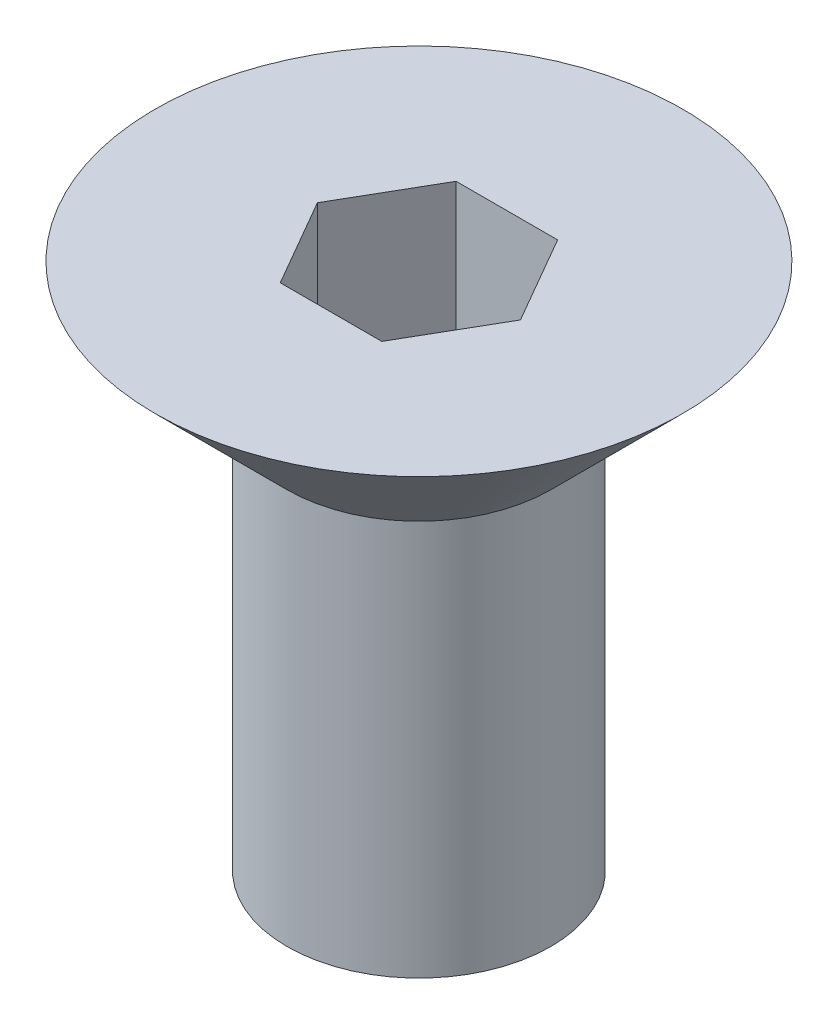
ISO-10303-21;
HEADER;
FILE_DESCRIPTION(('STEP AP214'),'2;1');
FILE_NAME('part.step','',(''),(''),'','','');
FILE_SCHEMA(('AUTOMOTIVE_DESIGN { 1 0 10303 214 1 1 1 1 }'));
ENDSEC;
DATA;
#1=APPLICATION_CONTEXT('core data for automotive mechanical design processes');
#2=APPLICATION_PROTOCOL_DEFINITION('international standard','automotive_design',2000,#1);
#3=PRODUCT_CONTEXT('',#1,'mechanical');
#4=PRODUCT('Part','Part','',(#3));
#5=PRODUCT_RELATED_PRODUCT_CATEGORY('part','',(#4));
#6=PRODUCT_DEFINITION_FORMATION('','',#4);
#7=PRODUCT_DEFINITION_CONTEXT('part definition',#1,'design');
#8=PRODUCT_DEFINITION('design','',#6,#7);
#9=PRODUCT_DEFINITION_SHAPE('','',#8);
#10=(LENGTH_UNIT() NAMED_UNIT(*) SI_UNIT(.MILLI.,.METRE.));
#11=(NAMED_UNIT(*) PLANE_ANGLE_UNIT() SI_UNIT($,.RADIAN.));
#12=(NAMED_UNIT(*) SI_UNIT($,.STERADIAN.) SOLID_ANGLE_UNIT());
#13=UNCERTAINTY_MEASURE_WITH_UNIT(LENGTH_MEASURE(1.E-05),#10,'distance_accuracy_value','');
#14=(GEOMETRIC_REPRESENTATION_CONTEXT(3) GLOBAL_UNCERTAINTY_ASSIGNED_CONTEXT((#13)) GLOBAL_UNIT_ASSIGNED_CONTEXT((#10,
#11,#12)) REPRESENTATION_CONTEXT('',''));
#15=CARTESIAN_POINT('',(0.,0.,0.));
#16=DIRECTION('',(0.,0.,1.));
#17=DIRECTION('',(1.,0.,0.));
#18=AXIS2_PLACEMENT_3D('',#15,#16,#17);
#19=CARTESIAN_POINT('',(0.,-6.,0.));
#20=DIRECTION('',(0.,1.,0.));
#21=DIRECTION('',(0.,0.,1.));
#22=AXIS2_PLACEMENT_3D('',#19,#20,#21);
#23=PLANE('',#22);
#24=CARTESIAN_POINT('',(0.,-6.00000000000001,0.));
#25=DIRECTION('',(0.,1.,0.));
#26=DIRECTION('',(0.,0.,1.));
#27=AXIS2_PLACEMENT_3D('',#24,#25,#26);
#28=CIRCLE('',#27,1.50000000000001);
#29=CARTESIAN_POINT('',(0.,-6.00000000000001,1.50000000000001));
#30=VERTEX_POINT('',#29);
#31=EDGE_CURVE('E11',#30,#30,#28,.T.);
#32=ORIENTED_EDGE('',*,*,#31,.F.);
#33=EDGE_LOOP('',(#32));
#34=FACE_BOUND('',#33,.T.);
#35=ADVANCED_FACE('F34',(#34),#23,.F.);
#36=CARTESIAN_POINT('',(0.,61.6916426261037,0.));
#37=DIRECTION('',(0.,1.,0.));
#38=DIRECTION('',(0.,0.,1.));
#39=AXIS2_PLACEMENT_3D('',#36,#37,#38);
#40=CYLINDRICAL_SURFACE('',#39,1.50000000000001);
#41=CARTESIAN_POINT('',(0.,-1.50000000000002,0.));
#42=DIRECTION('',(0.,1.,0.));
#43=DIRECTION('',(0.,0.,1.));
#44=AXIS2_PLACEMENT_3D('',#41,#42,#43);
#45=CIRCLE('',#44,1.50000000000001);
#46=CARTESIAN_POINT('',(0.,-1.50000000000002,1.50000000000001));
#47=VERTEX_POINT('',#46);
#48=EDGE_CURVE('E41',#47,#47,#45,.T.);
#49=ORIENTED_EDGE('',*,*,#48,.F.);
#50=EDGE_LOOP('',(#49));
#51=FACE_BOUND('',#50,.T.);
#52=ORIENTED_EDGE('',*,*,#31,.T.);
#53=EDGE_LOOP('',(#52));
#54=FACE_BOUND('',#53,.T.);
#55=ADVANCED_FACE('F147',(#51,#54),#40,.T.);
#56=CARTESIAN_POINT('',(0.,-1.50000000000002,0.));
#57=DIRECTION('',(0.,1.,0.));
#58=DIRECTION('',(0.,0.,1.));
#59=AXIS2_PLACEMENT_3D('',#56,#57,#58);
#60=CONICAL_SURFACE('',#59,1.50000000000001,0.785398163397443);
#61=CARTESIAN_POINT('',(0.,0.,0.));
#62=DIRECTION('',(0.,1.,0.));
#63=DIRECTION('',(0.,0.,1.));
#64=AXIS2_PLACEMENT_3D('',#61,#62,#63);
#65=CIRCLE('',#64,3.00000000000001);
#66=CARTESIAN_POINT('',(0.,0.,3.00000000000001));
#67=VERTEX_POINT('',#66);
#68=EDGE_CURVE('E135',#67,#67,#65,.T.);
#69=ORIENTED_EDGE('',*,*,#68,.F.);
#70=EDGE_LOOP('',(#69));
#71=FACE_BOUND('',#70,.T.);
#72=ORIENTED_EDGE('',*,*,#48,.T.);
#73=EDGE_LOOP('',(#72));
#74=FACE_BOUND('',#73,.T.);
#75=ADVANCED_FACE('F145',(#71,#74),#60,.T.);
#76=CARTESIAN_POINT('',(3.00000000000001,0.,0.));
#77=DIRECTION('',(0.,-1.,0.));
#78=DIRECTION('',(0.,0.,-1.));
#79=AXIS2_PLACEMENT_3D('',#76,#77,#78);
#80=PLANE('',#79);
#81=DIRECTION('',(-1.,0.,0.));
#82=VECTOR('',#81,1.);
#83=CARTESIAN_POINT('',(0.577350269189626,0.,-1.));
#84=LINE('',#83,#82);
#85=CARTESIAN_POINT('',(0.577350269189625,0.,-1.));
#86=VERTEX_POINT('',#85);
#87=CARTESIAN_POINT('',(-0.577350269189626,0.,-1.));
#88=VERTEX_POINT('',#87);
#89=EDGE_CURVE('E122',#86,#88,#84,.T.);
#90=ORIENTED_EDGE('',*,*,#89,.F.);
#91=DIRECTION('',(-0.5,0.,-0.866025403784439));
#92=VECTOR('',#91,1.);
#93=CARTESIAN_POINT('',(1.15470053837925,0.,0.));
#94=LINE('',#93,#92);
#95=CARTESIAN_POINT('',(1.15470053837925,0.,0.));
#96=VERTEX_POINT('',#95);
#97=EDGE_CURVE('E48',#96,#86,#94,.T.);
#98=ORIENTED_EDGE('',*,*,#97,.F.);
#99=DIRECTION('',(0.5,0.,-0.866025403784439));
#100=VECTOR('',#99,1.);
#101=CARTESIAN_POINT('',(0.577350269189626,0.,1.));
#102=LINE('',#101,#100);
#103=CARTESIAN_POINT('',(0.577350269189626,0.,1.));
#104=VERTEX_POINT('',#103);
#105=EDGE_CURVE('E131',#104,#96,#102,.T.);
#106=ORIENTED_EDGE('',*,*,#105,.F.);
#107=DIRECTION('',(1.,0.,0.));
#108=VECTOR('',#107,1.);
#109=CARTESIAN_POINT('',(-0.577350269189625,0.,1.));
#110=LINE('',#109,#108);
#111=CARTESIAN_POINT('',(-0.577350269189625,0.,1.));
#112=VERTEX_POINT('',#111);
#113=EDGE_CURVE('E129',#112,#104,#110,.T.);
#114=ORIENTED_EDGE('',*,*,#113,.F.);
#115=DIRECTION('',(0.5,0.,0.866025403784438));
#116=VECTOR('',#115,1.);
#117=CARTESIAN_POINT('',(-1.15470053837925,0.,0.));
#118=LINE('',#117,#116);
#119=CARTESIAN_POINT('',(-1.15470053837925,0.,0.));
#120=VERTEX_POINT('',#119);
#121=EDGE_CURVE('E96',#120,#112,#118,.T.);
#122=ORIENTED_EDGE('',*,*,#121,.F.);
#123=DIRECTION('',(-0.5,0.,0.866025403784439));
#124=VECTOR('',#123,1.);
#125=CARTESIAN_POINT('',(-0.577350269189626,0.,-1.));
#126=LINE('',#125,#124);
#127=EDGE_CURVE('E125',#88,#120,#126,.T.);
#128=ORIENTED_EDGE('',*,*,#127,.F.);
#129=EDGE_LOOP('',(#90,#98,#106,#114,#122,#128));
#130=FACE_BOUND('',#129,.T.);
#131=ORIENTED_EDGE('',*,*,#68,.T.);
#132=EDGE_LOOP('',(#131));
#133=FACE_BOUND('',#132,.T.);
#134=ADVANCED_FACE('F165',(#130,#133),#80,.F.);
#135=CARTESIAN_POINT('',(1.15470053837925,-1.5,0.));
#136=DIRECTION('',(0.866025403784439,0.,-0.5));
#137=DIRECTION('',(-0.5,0.,-0.866025403784439));
#138=AXIS2_PLACEMENT_3D('',#135,#136,#137);
#139=PLANE('',#138);
#140=ORIENTED_EDGE('',*,*,#97,.T.);
#141=DIRECTION('',(0.,1.,0.));
#142=VECTOR('',#141,1.);
#143=CARTESIAN_POINT('',(0.577350269189626,-1.5,-1.));
#144=LINE('',#143,#142);
#145=CARTESIAN_POINT('',(0.577350269189626,-1.5,-1.));
#146=VERTEX_POINT('',#145);
#147=EDGE_CURVE('E78',#146,#86,#144,.T.);
#148=ORIENTED_EDGE('',*,*,#147,.F.);
#149=DIRECTION('',(-0.5,0.,-0.866025403784439));
#150=VECTOR('',#149,1.);
#151=CARTESIAN_POINT('',(1.15470053837925,-1.5,0.));
#152=LINE('',#151,#150);
#153=CARTESIAN_POINT('',(1.15470053837925,-1.5,0.));
#154=VERTEX_POINT('',#153);
#155=EDGE_CURVE('E133',#154,#146,#152,.T.);
#156=ORIENTED_EDGE('',*,*,#155,.F.);
#157=DIRECTION('',(0.,1.,0.));
#158=VECTOR('',#157,1.);
#159=CARTESIAN_POINT('',(1.15470053837925,-1.5,0.));
#160=LINE('',#159,#158);
#161=EDGE_CURVE('E56',#154,#96,#160,.T.);
#162=ORIENTED_EDGE('',*,*,#161,.T.);
#163=EDGE_LOOP('',(#140,#148,#156,#162));
#164=FACE_BOUND('',#163,.T.);
#165=ADVANCED_FACE('F173',(#164),#139,.F.);
#166=CARTESIAN_POINT('',(0.577350269189626,-1.5,1.));
#167=DIRECTION('',(0.866025403784439,0.,0.5));
#168=DIRECTION('',(0.5,0.,-0.866025403784439));
#169=AXIS2_PLACEMENT_3D('',#166,#167,#168);
#170=PLANE('',#169);
#171=ORIENTED_EDGE('',*,*,#105,.T.);
#172=ORIENTED_EDGE('',*,*,#161,.F.);
#173=DIRECTION('',(0.5,0.,-0.866025403784439));
#174=VECTOR('',#173,1.);
#175=CARTESIAN_POINT('',(0.577350269189626,-1.5,1.));
#176=LINE('',#175,#174);
#177=CARTESIAN_POINT('',(0.577350269189626,-1.5,1.));
#178=VERTEX_POINT('',#177);
#179=EDGE_CURVE('E108',#178,#154,#176,.T.);
#180=ORIENTED_EDGE('',*,*,#179,.F.);
#181=DIRECTION('',(0.,1.,0.));
#182=VECTOR('',#181,1.);
#183=CARTESIAN_POINT('',(0.577350269189626,-1.5,1.));
#184=LINE('',#183,#182);
#185=EDGE_CURVE('E100',#178,#104,#184,.T.);
#186=ORIENTED_EDGE('',*,*,#185,.T.);
#187=EDGE_LOOP('',(#171,#172,#180,#186));
#188=FACE_BOUND('',#187,.T.);
#189=ADVANCED_FACE('F181',(#188),#170,.F.);
#190=CARTESIAN_POINT('',(-0.577350269189625,-1.5,1.));
#191=DIRECTION('',(0.,0.,1.));
#192=DIRECTION('',(1.,0.,0.));
#193=AXIS2_PLACEMENT_3D('',#190,#191,#192);
#194=PLANE('',#193);
#195=ORIENTED_EDGE('',*,*,#113,.T.);
#196=ORIENTED_EDGE('',*,*,#185,.F.);
#197=DIRECTION('',(1.,0.,0.));
#198=VECTOR('',#197,1.);
#199=CARTESIAN_POINT('',(-0.577350269189625,-1.5,1.));
#200=LINE('',#199,#198);
#201=CARTESIAN_POINT('',(-0.577350269189625,-1.5,1.));
#202=VERTEX_POINT('',#201);
#203=EDGE_CURVE('E104',#202,#178,#200,.T.);
#204=ORIENTED_EDGE('',*,*,#203,.F.);
#205=DIRECTION('',(0.,1.,0.));
#206=VECTOR('',#205,1.);
#207=CARTESIAN_POINT('',(-0.577350269189625,-1.5,1.));
#208=LINE('',#207,#206);
#209=EDGE_CURVE('E89',#202,#112,#208,.T.);
#210=ORIENTED_EDGE('',*,*,#209,.T.);
#211=EDGE_LOOP('',(#195,#196,#204,#210));
#212=FACE_BOUND('',#211,.T.);
#213=ADVANCED_FACE('F105',(#212),#194,.F.);
#214=CARTESIAN_POINT('',(-1.15470053837925,-1.5,0.));
#215=DIRECTION('',(-0.866025403784438,0.,0.5));
#216=DIRECTION('',(0.5,0.,0.866025403784439));
#217=AXIS2_PLACEMENT_3D('',#214,#215,#216);
#218=PLANE('',#217);
#219=ORIENTED_EDGE('',*,*,#121,.T.);
#220=ORIENTED_EDGE('',*,*,#209,.F.);
#221=DIRECTION('',(0.5,0.,0.866025403784438));
#222=VECTOR('',#221,1.);
#223=CARTESIAN_POINT('',(-1.15470053837925,-1.5,0.));
#224=LINE('',#223,#222);
#225=CARTESIAN_POINT('',(-1.15470053837925,-1.5,0.));
#226=VERTEX_POINT('',#225);
#227=EDGE_CURVE('E93',#226,#202,#224,.T.);
#228=ORIENTED_EDGE('',*,*,#227,.F.);
#229=DIRECTION('',(0.,1.,0.));
#230=VECTOR('',#229,1.);
#231=CARTESIAN_POINT('',(-1.15470053837925,-1.5,0.));
#232=LINE('',#231,#230);
#233=EDGE_CURVE('E101',#226,#120,#232,.T.);
#234=ORIENTED_EDGE('',*,*,#233,.T.);
#235=EDGE_LOOP('',(#219,#220,#228,#234));
#236=FACE_BOUND('',#235,.T.);
#237=ADVANCED_FACE('F91',(#236),#218,.F.);
#238=CARTESIAN_POINT('',(-0.577350269189626,-1.5,-1.));
#239=DIRECTION('',(-0.866025403784439,0.,-0.5));
#240=DIRECTION('',(-0.5,0.,0.866025403784439));
#241=AXIS2_PLACEMENT_3D('',#238,#239,#240);
#242=PLANE('',#241);
#243=ORIENTED_EDGE('',*,*,#127,.T.);
#244=ORIENTED_EDGE('',*,*,#233,.F.);
#245=DIRECTION('',(-0.5,0.,0.866025403784439));
#246=VECTOR('',#245,1.);
#247=CARTESIAN_POINT('',(-0.577350269189626,-1.5,-1.));
#248=LINE('',#247,#246);
#249=CARTESIAN_POINT('',(-0.577350269189626,-1.5,-1.));
#250=VERTEX_POINT('',#249);
#251=EDGE_CURVE('E114',#250,#226,#248,.T.);
#252=ORIENTED_EDGE('',*,*,#251,.F.);
#253=DIRECTION('',(0.,1.,0.));
#254=VECTOR('',#253,1.);
#255=CARTESIAN_POINT('',(-0.577350269189626,-1.5,-1.));
#256=LINE('',#255,#254);
#257=EDGE_CURVE('E138',#250,#88,#256,.T.);
#258=ORIENTED_EDGE('',*,*,#257,.T.);
#259=EDGE_LOOP('',(#243,#244,#252,#258));
#260=FACE_BOUND('',#259,.T.);
#261=ADVANCED_FACE('F200',(#260),#242,.F.);
#262=CARTESIAN_POINT('',(0.577350269189626,-1.5,-1.));
#263=DIRECTION('',(0.,0.,-1.));
#264=DIRECTION('',(-1.,0.,0.));
#265=AXIS2_PLACEMENT_3D('',#262,#263,#264);
#266=PLANE('',#265);
#267=ORIENTED_EDGE('',*,*,#89,.T.);
#268=ORIENTED_EDGE('',*,*,#257,.F.);
#269=DIRECTION('',(-1.,0.,0.));
#270=VECTOR('',#269,1.);
#271=CARTESIAN_POINT('',(0.577350269189626,-1.5,-1.));
#272=LINE('',#271,#270);
#273=EDGE_CURVE('E116',#146,#250,#272,.T.);
#274=ORIENTED_EDGE('',*,*,#273,.F.);
#275=ORIENTED_EDGE('',*,*,#147,.T.);
#276=EDGE_LOOP('',(#267,#268,#274,#275));
#277=FACE_BOUND('',#276,.T.);
#278=ADVANCED_FACE('F207',(#277),#266,.F.);
#279=CARTESIAN_POINT('',(0.,-1.5,-2.));
#280=DIRECTION('',(0.,1.,0.));
#281=DIRECTION('',(0.,0.,1.));
#282=AXIS2_PLACEMENT_3D('',#279,#280,#281);
#283=PLANE('',#282);
#284=ORIENTED_EDGE('',*,*,#155,.T.);
#285=ORIENTED_EDGE('',*,*,#273,.T.);
#286=ORIENTED_EDGE('',*,*,#251,.T.);
#287=ORIENTED_EDGE('',*,*,#227,.T.);
#288=ORIENTED_EDGE('',*,*,#203,.T.);
#289=ORIENTED_EDGE('',*,*,#179,.T.);
#290=EDGE_LOOP('',(#284,#285,#286,#287,#288,#289));
#291=FACE_BOUND('',#290,.T.);
#292=ADVANCED_FACE('F111',(#291),#283,.T.);
#293=CLOSED_SHELL('',(#35,#55,#75,#134,#165,#189,#213,#237,#261,#278,#292));
#294=MANIFOLD_SOLID_BREP('B2',#293);
#295=ADVANCED_BREP_SHAPE_REPRESENTATION('',(#18,#294),#14);
#296=SHAPE_DEFINITION_REPRESENTATION(#9,#295);
ENDSEC;
END-ISO-10303-21;
